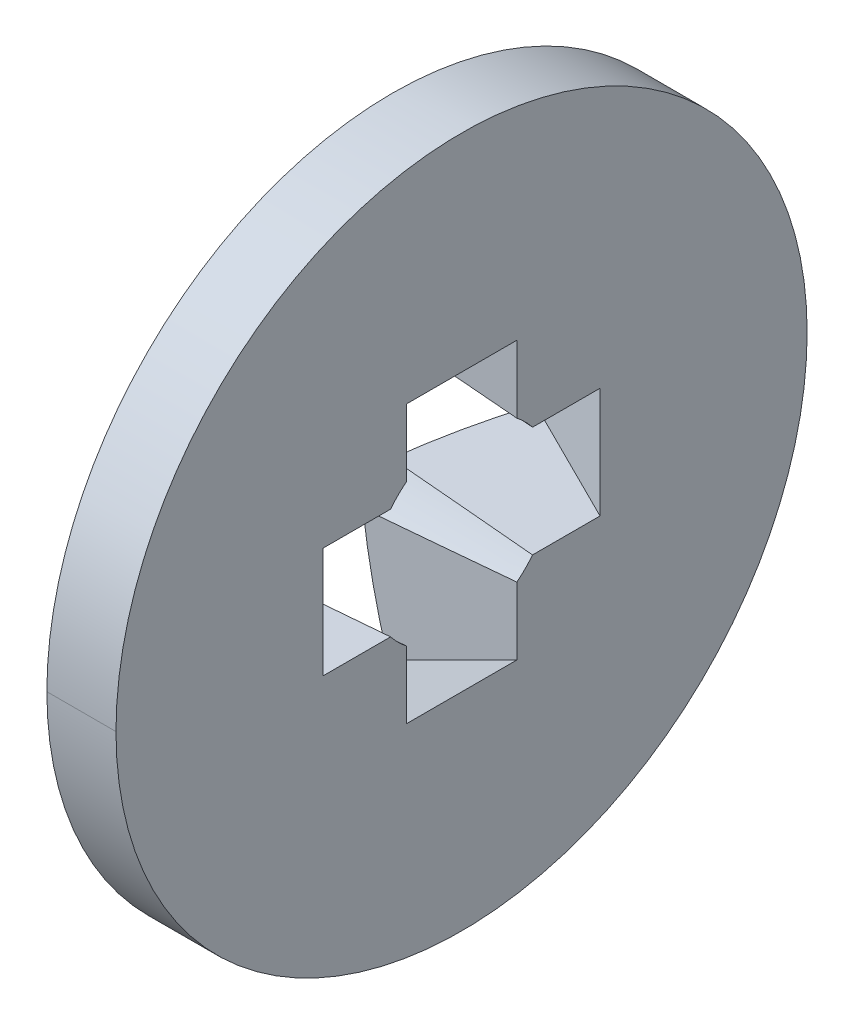
ISO-10303-21;
HEADER;
FILE_DESCRIPTION(('STEP AP214'),'2;1');
FILE_NAME('part.step','',(''),(''),'','','');
FILE_SCHEMA(('AUTOMOTIVE_DESIGN { 1 0 10303 214 1 1 1 1 }'));
ENDSEC;
DATA;
#1=APPLICATION_CONTEXT('core data for automotive mechanical design processes');
#2=APPLICATION_PROTOCOL_DEFINITION('international standard','automotive_design',2000,#1);
#3=PRODUCT_CONTEXT('',#1,'mechanical');
#4=PRODUCT('Part','Part','',(#3));
#5=PRODUCT_RELATED_PRODUCT_CATEGORY('part','',(#4));
#6=PRODUCT_DEFINITION_FORMATION('','',#4);
#7=PRODUCT_DEFINITION_CONTEXT('part definition',#1,'design');
#8=PRODUCT_DEFINITION('design','',#6,#7);
#9=PRODUCT_DEFINITION_SHAPE('','',#8);
#10=(LENGTH_UNIT() NAMED_UNIT(*) SI_UNIT(.MILLI.,.METRE.));
#11=(NAMED_UNIT(*) PLANE_ANGLE_UNIT() SI_UNIT($,.RADIAN.));
#12=(NAMED_UNIT(*) SI_UNIT($,.STERADIAN.) SOLID_ANGLE_UNIT());
#13=UNCERTAINTY_MEASURE_WITH_UNIT(LENGTH_MEASURE(1.E-05),#10,'distance_accuracy_value','');
#14=(GEOMETRIC_REPRESENTATION_CONTEXT(3) GLOBAL_UNCERTAINTY_ASSIGNED_CONTEXT((#13)) GLOBAL_UNIT_ASSIGNED_CONTEXT((#10,
#11,#12)) REPRESENTATION_CONTEXT('',''));
#15=CARTESIAN_POINT('',(0.,0.,0.));
#16=DIRECTION('',(0.,0.,1.));
#17=DIRECTION('',(1.,0.,0.));
#18=AXIS2_PLACEMENT_3D('',#15,#16,#17);
#19=CARTESIAN_POINT('',(0.7,0.,0.));
#20=DIRECTION('',(1.,0.,0.));
#21=DIRECTION('',(0.,0.,-1.));
#22=AXIS2_PLACEMENT_3D('',#19,#20,#21);
#23=PLANE('',#22);
#24=CARTESIAN_POINT('',(0.7,0.,0.));
#25=DIRECTION('',(-1.,0.,0.));
#26=DIRECTION('',(0.,0.,1.));
#27=AXIS2_PLACEMENT_3D('',#24,#25,#26);
#28=CIRCLE('',#27,1.5);
#29=CARTESIAN_POINT('',(0.7,0.,1.5));
#30=VERTEX_POINT('',#29);
#31=CARTESIAN_POINT('',(0.7,0.,-1.5));
#32=VERTEX_POINT('',#31);
#33=EDGE_CURVE('E48',#30,#32,#28,.T.);
#34=ORIENTED_EDGE('',*,*,#33,.F.);
#35=CARTESIAN_POINT('',(0.7,0.,0.));
#36=DIRECTION('',(-1.,0.,0.));
#37=DIRECTION('',(0.,0.,1.));
#38=AXIS2_PLACEMENT_3D('',#35,#36,#37);
#39=CIRCLE('',#38,1.5);
#40=EDGE_CURVE('E295',#32,#30,#39,.T.);
#41=ORIENTED_EDGE('',*,*,#40,.F.);
#42=EDGE_LOOP('',(#34,#41));
#43=FACE_BOUND('',#42,.T.);
#44=DIRECTION('',(0.,0.,1.));
#45=VECTOR('',#44,1.);
#46=CARTESIAN_POINT('',(0.7,0.24,0.351702170390125));
#47=LINE('',#46,#45);
#48=CARTESIAN_POINT('',(0.700000062642924,0.240005255745666,0.307988734916733));
#49=VERTEX_POINT('',#48);
#50=CARTESIAN_POINT('',(0.700000000000001,0.239999999999998,0.600992932727572));
#51=VERTEX_POINT('',#50);
#52=EDGE_CURVE('E272',#49,#51,#47,.T.);
#53=ORIENTED_EDGE('',*,*,#52,.F.);
#54=CARTESIAN_POINT('',(0.7,0.,0.));
#55=DIRECTION('',(1.,0.,0.));
#56=DIRECTION('',(0.,0.,-1.));
#57=AXIS2_PLACEMENT_3D('',#54,#55,#56);
#58=CIRCLE('',#57,0.390463405971752);
#59=CARTESIAN_POINT('',(0.700000062674974,0.307988734913892,0.240005255745666));
#60=VERTEX_POINT('',#59);
#61=EDGE_CURVE('E279',#49,#60,#58,.F.);
#62=ORIENTED_EDGE('',*,*,#61,.T.);
#63=DIRECTION('',(0.,-1.,0.));
#64=VECTOR('',#63,1.);
#65=CARTESIAN_POINT('',(0.7,-0.351702170390125,0.24));
#66=LINE('',#65,#64);
#67=CARTESIAN_POINT('',(0.700000000000001,0.600992932727572,0.24));
#68=VERTEX_POINT('',#67);
#69=EDGE_CURVE('E277',#68,#60,#66,.T.);
#70=ORIENTED_EDGE('',*,*,#69,.F.);
#71=DIRECTION('',(0.,0.,-1.));
#72=VECTOR('',#71,1.);
#73=CARTESIAN_POINT('',(0.7,0.600992932727573,0.24));
#74=LINE('',#73,#72);
#75=CARTESIAN_POINT('',(0.700000000000001,0.600992932727572,-0.24));
#76=VERTEX_POINT('',#75);
#77=EDGE_CURVE('E63',#68,#76,#74,.T.);
#78=ORIENTED_EDGE('',*,*,#77,.T.);
#79=DIRECTION('',(0.,1.,0.));
#80=VECTOR('',#79,1.);
#81=CARTESIAN_POINT('',(0.7,0.351702170390125,-0.24));
#82=LINE('',#81,#80);
#83=CARTESIAN_POINT('',(0.700000062642924,0.307988734916733,-0.240005255745666));
#84=VERTEX_POINT('',#83);
#85=EDGE_CURVE('E56',#84,#76,#82,.T.);
#86=ORIENTED_EDGE('',*,*,#85,.F.);
#87=CARTESIAN_POINT('',(0.7,0.,0.));
#88=DIRECTION('',(1.,0.,0.));
#89=DIRECTION('',(0.,0.,-1.));
#90=AXIS2_PLACEMENT_3D('',#87,#88,#89);
#91=CIRCLE('',#90,0.390463405971752);
#92=CARTESIAN_POINT('',(0.700000062674974,0.240005255745668,-0.30798873491389));
#93=VERTEX_POINT('',#92);
#94=EDGE_CURVE('E250',#84,#93,#91,.F.);
#95=ORIENTED_EDGE('',*,*,#94,.T.);
#96=DIRECTION('',(0.,0.,1.));
#97=VECTOR('',#96,1.);
#98=CARTESIAN_POINT('',(0.7,0.24,0.351702170390125));
#99=LINE('',#98,#97);
#100=CARTESIAN_POINT('',(0.700000000000001,0.240000000000002,-0.600992932727573));
#101=VERTEX_POINT('',#100);
#102=EDGE_CURVE('E242',#101,#93,#99,.T.);
#103=ORIENTED_EDGE('',*,*,#102,.F.);
#104=DIRECTION('',(0.,-1.,0.));
#105=VECTOR('',#104,1.);
#106=CARTESIAN_POINT('',(0.7,0.240000000000001,-0.600992932727571));
#107=LINE('',#106,#105);
#108=CARTESIAN_POINT('',(0.700000000000001,-0.239999999999997,-0.600992932727573));
#109=VERTEX_POINT('',#108);
#110=EDGE_CURVE('E225',#101,#109,#107,.T.);
#111=ORIENTED_EDGE('',*,*,#110,.T.);
#112=DIRECTION('',(0.,0.,-1.));
#113=VECTOR('',#112,1.);
#114=CARTESIAN_POINT('',(0.7,-0.24,-0.351702170390125));
#115=LINE('',#114,#113);
#116=CARTESIAN_POINT('',(0.700000062642925,-0.240005255745665,-0.307988734916734));
#117=VERTEX_POINT('',#116);
#118=EDGE_CURVE('E226',#117,#109,#115,.T.);
#119=ORIENTED_EDGE('',*,*,#118,.F.);
#120=CARTESIAN_POINT('',(0.7,0.,0.));
#121=DIRECTION('',(1.,0.,0.));
#122=DIRECTION('',(0.,0.,-1.));
#123=AXIS2_PLACEMENT_3D('',#120,#121,#122);
#124=CIRCLE('',#123,0.390463405971752);
#125=CARTESIAN_POINT('',(0.7,-0.307988028624602,-0.24001051149271));
#126=VERTEX_POINT('',#125);
#127=EDGE_CURVE('E12',#117,#126,#124,.F.);
#128=ORIENTED_EDGE('',*,*,#127,.T.);
#129=DIRECTION('',(0.,1.,0.));
#130=VECTOR('',#129,1.);
#131=CARTESIAN_POINT('',(0.7,0.351702170390125,-0.24));
#132=LINE('',#131,#130);
#133=CARTESIAN_POINT('',(0.700000000000001,-0.600992932727573,-0.24));
#134=VERTEX_POINT('',#133);
#135=EDGE_CURVE('E220',#134,#126,#132,.T.);
#136=ORIENTED_EDGE('',*,*,#135,.F.);
#137=DIRECTION('',(0.,0.,1.));
#138=VECTOR('',#137,1.);
#139=CARTESIAN_POINT('',(0.7,-0.600992932727572,-0.24));
#140=LINE('',#139,#138);
#141=CARTESIAN_POINT('',(0.700000000000001,-0.600992932727573,0.24));
#142=VERTEX_POINT('',#141);
#143=EDGE_CURVE('E244',#134,#142,#140,.T.);
#144=ORIENTED_EDGE('',*,*,#143,.T.);
#145=DIRECTION('',(0.,-1.,0.));
#146=VECTOR('',#145,1.);
#147=CARTESIAN_POINT('',(0.7,-0.351702170390125,0.24));
#148=LINE('',#147,#146);
#149=CARTESIAN_POINT('',(0.700000062642924,-0.307988734916733,0.240005255745666));
#150=VERTEX_POINT('',#149);
#151=EDGE_CURVE('E248',#150,#142,#148,.T.);
#152=ORIENTED_EDGE('',*,*,#151,.F.);
#153=CARTESIAN_POINT('',(0.7,0.,0.));
#154=DIRECTION('',(1.,0.,0.));
#155=DIRECTION('',(0.,0.,-1.));
#156=AXIS2_PLACEMENT_3D('',#153,#154,#155);
#157=CIRCLE('',#156,0.390463405971752);
#158=CARTESIAN_POINT('',(0.700000062674974,-0.240005255745667,0.307988734913891));
#159=VERTEX_POINT('',#158);
#160=EDGE_CURVE('E255',#150,#159,#157,.F.);
#161=ORIENTED_EDGE('',*,*,#160,.T.);
#162=DIRECTION('',(0.,0.,-1.));
#163=VECTOR('',#162,1.);
#164=CARTESIAN_POINT('',(0.7,-0.24,-0.351702170390125));
#165=LINE('',#164,#163);
#166=CARTESIAN_POINT('',(0.700000000000001,-0.240000000000002,0.600992932727572));
#167=VERTEX_POINT('',#166);
#168=EDGE_CURVE('E260',#167,#159,#165,.T.);
#169=ORIENTED_EDGE('',*,*,#168,.F.);
#170=DIRECTION('',(0.,1.,0.));
#171=VECTOR('',#170,1.);
#172=CARTESIAN_POINT('',(0.7,-0.240000000000001,0.600992932727572));
#173=LINE('',#172,#171);
#174=EDGE_CURVE('E267',#167,#51,#173,.T.);
#175=ORIENTED_EDGE('',*,*,#174,.T.);
#176=EDGE_LOOP('',(#53,#62,#70,#78,#86,#95,#103,#111,#119,#128,#136,#144,#152,#161,#169,#175));
#177=FACE_BOUND('',#176,.T.);
#178=ADVANCED_FACE('F37',(#43,#177),#23,.T.);
#179=CARTESIAN_POINT('',(1.2,0.351702170390125,-0.24));
#180=DIRECTION('',(0.,0.,1.));
#181=DIRECTION('',(1.,0.,0.));
#182=AXIS2_PLACEMENT_3D('',#179,#180,#181);
#183=PLANE('',#182);
#184=CARTESIAN_POINT('',(0.0318913292717859,0.365415109129044,-0.24));
#185=CARTESIAN_POINT('',(0.71193204756683,0.308522672736319,-0.24));
#186=CARTESIAN_POINT('',(1.2,0.262259890185287,-0.24));
#187=B_SPLINE_CURVE_WITH_KNOTS('',2,(#184,#185,#186),.UNSPECIFIED.,.F.,.F.,(3,3),(0.,1.),.UNSPECIFIED.);
#188=CARTESIAN_POINT('',(0.0318913292717861,0.365415109129044,-0.24));
#189=VERTEX_POINT('',#188);
#190=EDGE_CURVE('E215',#189,#84,#187,.T.);
#191=ORIENTED_EDGE('',*,*,#190,.T.);
#192=ORIENTED_EDGE('',*,*,#85,.T.);
#193=DIRECTION('',(0.894934391398443,-0.446197753347436,0.));
#194=VECTOR('',#193,1.);
#195=CARTESIAN_POINT('',(0.,0.95,-0.24));
#196=LINE('',#195,#194);
#197=CARTESIAN_POINT('',(0.141276153719429,0.879562319878362,-0.24));
#198=VERTEX_POINT('',#197);
#199=EDGE_CURVE('E337',#198,#76,#196,.T.);
#200=ORIENTED_EDGE('',*,*,#199,.F.);
#201=CARTESIAN_POINT('',(3.0125,0.,-0.24));
#202=DIRECTION('',(0.,0.,-1.));
#203=DIRECTION('',(1.,0.,0.));
#204=AXIS2_PLACEMENT_3D('',#201,#202,#203);
#205=CIRCLE('',#204,3.00292461610344);
#206=EDGE_CURVE('E438',#189,#198,#205,.T.);
#207=ORIENTED_EDGE('',*,*,#206,.F.);
#208=EDGE_LOOP('',(#191,#192,#200,#207));
#209=FACE_BOUND('',#208,.T.);
#210=ADVANCED_FACE('F385',(#209),#183,.T.);
#211=CARTESIAN_POINT('',(1.2,0.351702170390125,-0.24));
#212=DIRECTION('',(0.,0.,1.));
#213=DIRECTION('',(1.,0.,0.));
#214=AXIS2_PLACEMENT_3D('',#211,#212,#213);
#215=PLANE('',#214);
#216=DIRECTION('',(0.894934391398443,0.446197753347435,0.));
#217=VECTOR('',#216,1.);
#218=CARTESIAN_POINT('',(0.,-0.95,-0.24));
#219=LINE('',#218,#217);
#220=CARTESIAN_POINT('',(0.141276153719429,-0.879562319878361,-0.24));
#221=VERTEX_POINT('',#220);
#222=EDGE_CURVE('E216',#221,#134,#219,.T.);
#223=ORIENTED_EDGE('',*,*,#222,.T.);
#224=ORIENTED_EDGE('',*,*,#135,.T.);
#225=CARTESIAN_POINT('',(1.2,-0.262259890185288,-0.24));
#226=CARTESIAN_POINT('',(0.711932047566841,-0.308522672736318,-0.24));
#227=CARTESIAN_POINT('',(0.0318913292717859,-0.365415109129044,-0.24));
#228=B_SPLINE_CURVE_WITH_KNOTS('',2,(#225,#226,#227),.UNSPECIFIED.,.F.,.F.,(3,3),(0.,1.),.UNSPECIFIED.);
#229=CARTESIAN_POINT('',(0.0318913292717861,-0.365415109129044,-0.24));
#230=VERTEX_POINT('',#229);
#231=EDGE_CURVE('E203',#126,#230,#228,.T.);
#232=ORIENTED_EDGE('',*,*,#231,.T.);
#233=CARTESIAN_POINT('',(3.0125,0.,-0.24));
#234=DIRECTION('',(0.,0.,-1.));
#235=DIRECTION('',(1.,0.,0.));
#236=AXIS2_PLACEMENT_3D('',#233,#234,#235);
#237=CIRCLE('',#236,3.00292461610344);
#238=EDGE_CURVE('E336',#221,#230,#237,.T.);
#239=ORIENTED_EDGE('',*,*,#238,.F.);
#240=EDGE_LOOP('',(#223,#224,#232,#239));
#241=FACE_BOUND('',#240,.T.);
#242=ADVANCED_FACE('F221',(#241),#215,.T.);
#243=CARTESIAN_POINT('',(1.2,-0.351702170390125,0.24));
#244=DIRECTION('',(0.,0.,-1.));
#245=DIRECTION('',(0.,-1.,0.));
#246=AXIS2_PLACEMENT_3D('',#243,#244,#245);
#247=PLANE('',#246);
#248=DIRECTION('',(0.894934391398443,-0.446197753347436,0.));
#249=VECTOR('',#248,1.);
#250=CARTESIAN_POINT('',(0.,0.95,0.24));
#251=LINE('',#250,#249);
#252=CARTESIAN_POINT('',(0.141276153719429,0.879562319878362,0.24));
#253=VERTEX_POINT('',#252);
#254=EDGE_CURVE('E372',#253,#68,#251,.T.);
#255=ORIENTED_EDGE('',*,*,#254,.T.);
#256=ORIENTED_EDGE('',*,*,#69,.T.);
#257=CARTESIAN_POINT('',(1.2,0.262259890185288,0.24));
#258=CARTESIAN_POINT('',(0.711932047566804,0.308522672736322,0.24));
#259=CARTESIAN_POINT('',(0.0318913292717859,0.365415109129044,0.24));
#260=B_SPLINE_CURVE_WITH_KNOTS('',2,(#257,#258,#259),.UNSPECIFIED.,.F.,.F.,(3,3),(0.,1.),.UNSPECIFIED.);
#261=CARTESIAN_POINT('',(0.0318913292717861,0.365415109129044,0.24));
#262=VERTEX_POINT('',#261);
#263=EDGE_CURVE('E362',#60,#262,#260,.T.);
#264=ORIENTED_EDGE('',*,*,#263,.T.);
#265=CARTESIAN_POINT('',(3.0125,0.,0.24));
#266=DIRECTION('',(0.,0.,1.));
#267=DIRECTION('',(-1.,0.,0.));
#268=AXIS2_PLACEMENT_3D('',#265,#266,#267);
#269=CIRCLE('',#268,3.00292461610344);
#270=EDGE_CURVE('E332',#253,#262,#269,.T.);
#271=ORIENTED_EDGE('',*,*,#270,.F.);
#272=EDGE_LOOP('',(#255,#256,#264,#271));
#273=FACE_BOUND('',#272,.T.);
#274=ADVANCED_FACE('F498',(#273),#247,.T.);
#275=CARTESIAN_POINT('',(1.2,-0.351702170390125,0.24));
#276=DIRECTION('',(0.,0.,-1.));
#277=DIRECTION('',(0.,-1.,0.));
#278=AXIS2_PLACEMENT_3D('',#275,#276,#277);
#279=PLANE('',#278);
#280=CARTESIAN_POINT('',(0.0318913292717859,-0.365415109129044,0.24));
#281=CARTESIAN_POINT('',(0.711932047566801,-0.308522672736322,0.24));
#282=CARTESIAN_POINT('',(1.2,-0.262259890185288,0.24));
#283=B_SPLINE_CURVE_WITH_KNOTS('',2,(#280,#281,#282),.UNSPECIFIED.,.F.,.F.,(3,3),(0.,1.),.UNSPECIFIED.);
#284=CARTESIAN_POINT('',(0.0318913292717861,-0.365415109129044,0.24));
#285=VERTEX_POINT('',#284);
#286=EDGE_CURVE('E327',#285,#150,#283,.T.);
#287=ORIENTED_EDGE('',*,*,#286,.T.);
#288=ORIENTED_EDGE('',*,*,#151,.T.);
#289=DIRECTION('',(0.894934391398443,0.446197753347435,0.));
#290=VECTOR('',#289,1.);
#291=CARTESIAN_POINT('',(0.,-0.95,0.24));
#292=LINE('',#291,#290);
#293=CARTESIAN_POINT('',(0.141276153719429,-0.879562319878361,0.24));
#294=VERTEX_POINT('',#293);
#295=EDGE_CURVE('E319',#294,#142,#292,.T.);
#296=ORIENTED_EDGE('',*,*,#295,.F.);
#297=CARTESIAN_POINT('',(3.0125,0.,0.24));
#298=DIRECTION('',(0.,0.,1.));
#299=DIRECTION('',(-1.,0.,0.));
#300=AXIS2_PLACEMENT_3D('',#297,#298,#299);
#301=CIRCLE('',#300,3.00292461610344);
#302=EDGE_CURVE('E299',#285,#294,#301,.T.);
#303=ORIENTED_EDGE('',*,*,#302,.F.);
#304=EDGE_LOOP('',(#287,#288,#296,#303));
#305=FACE_BOUND('',#304,.T.);
#306=ADVANCED_FACE('F508',(#305),#279,.T.);
#307=CARTESIAN_POINT('',(1.2,0.351702170390125,0.24));
#308=DIRECTION('',(0.446197753347436,0.894934391398443,0.));
#309=DIRECTION('',(0.,0.,-1.));
#310=AXIS2_PLACEMENT_3D('',#307,#308,#309);
#311=PLANE('',#310);
#312=ORIENTED_EDGE('',*,*,#77,.F.);
#313=ORIENTED_EDGE('',*,*,#254,.F.);
#314=CARTESIAN_POINT('',(2.79208586837802,-0.442082429279145,0.));
#315=DIRECTION('',(-0.446197753347436,-0.894934391398443,0.));
#316=DIRECTION('',(-0.894934391398443,0.446197753347436,0.));
#317=AXIS2_PLACEMENT_3D('',#314,#315,#316);
#318=CIRCLE('',#317,2.97172289864044);
#319=CARTESIAN_POINT('',(0.132588844678418,0.883893651665352,0.));
#320=VERTEX_POINT('',#319);
#321=EDGE_CURVE('E324',#253,#320,#318,.T.);
#322=ORIENTED_EDGE('',*,*,#321,.T.);
#323=CARTESIAN_POINT('',(2.79208586837802,-0.442082429279145,0.));
#324=DIRECTION('',(-0.446197753347436,-0.894934391398443,0.));
#325=DIRECTION('',(-0.894934391398443,0.446197753347436,0.));
#326=AXIS2_PLACEMENT_3D('',#323,#324,#325);
#327=CIRCLE('',#326,2.97172289864044);
#328=EDGE_CURVE('E328',#320,#198,#327,.T.);
#329=ORIENTED_EDGE('',*,*,#328,.T.);
#330=ORIENTED_EDGE('',*,*,#199,.T.);
#331=EDGE_LOOP('',(#312,#313,#322,#329,#330));
#332=FACE_BOUND('',#331,.T.);
#333=ADVANCED_FACE('F519',(#332),#311,.F.);
#334=CARTESIAN_POINT('',(1.2,-0.351702170390125,-0.24));
#335=DIRECTION('',(0.446197753347435,-0.894934391398443,0.));
#336=DIRECTION('',(0.,0.,-1.));
#337=AXIS2_PLACEMENT_3D('',#334,#335,#336);
#338=PLANE('',#337);
#339=ORIENTED_EDGE('',*,*,#143,.F.);
#340=ORIENTED_EDGE('',*,*,#222,.F.);
#341=CARTESIAN_POINT('',(2.79208586837802,0.442082429279144,0.));
#342=DIRECTION('',(-0.446197753347435,0.894934391398443,0.));
#343=DIRECTION('',(0.894934391398443,0.446197753347435,0.));
#344=AXIS2_PLACEMENT_3D('',#341,#342,#343);
#345=CIRCLE('',#344,2.97172289864044);
#346=CARTESIAN_POINT('',(0.132588844678418,-0.88389365166535,0.));
#347=VERTEX_POINT('',#346);
#348=EDGE_CURVE('E340',#221,#347,#345,.T.);
#349=ORIENTED_EDGE('',*,*,#348,.T.);
#350=CARTESIAN_POINT('',(2.79208586837802,0.442082429279144,0.));
#351=DIRECTION('',(-0.446197753347435,0.894934391398443,0.));
#352=DIRECTION('',(0.894934391398443,0.446197753347435,0.));
#353=AXIS2_PLACEMENT_3D('',#350,#351,#352);
#354=CIRCLE('',#353,2.97172289864044);
#355=EDGE_CURVE('E323',#347,#294,#354,.T.);
#356=ORIENTED_EDGE('',*,*,#355,.T.);
#357=ORIENTED_EDGE('',*,*,#295,.T.);
#358=EDGE_LOOP('',(#339,#340,#349,#356,#357));
#359=FACE_BOUND('',#358,.T.);
#360=ADVANCED_FACE('F395',(#359),#338,.F.);
#361=CARTESIAN_POINT('',(1.2,-0.24,-0.351702170390125));
#362=DIRECTION('',(0.,1.,0.));
#363=DIRECTION('',(1.,0.,0.));
#364=AXIS2_PLACEMENT_3D('',#361,#362,#363);
#365=PLANE('',#364);
#366=DIRECTION('',(0.894934391398443,0.,-0.446197753347436));
#367=VECTOR('',#366,1.);
#368=CARTESIAN_POINT('',(0.,-0.240000000000003,0.95));
#369=LINE('',#368,#367);
#370=CARTESIAN_POINT('',(0.141276153719429,-0.240000000000002,0.879562319878361));
#371=VERTEX_POINT('',#370);
#372=EDGE_CURVE('E301',#371,#167,#369,.T.);
#373=ORIENTED_EDGE('',*,*,#372,.T.);
#374=ORIENTED_EDGE('',*,*,#168,.T.);
#375=CARTESIAN_POINT('',(1.2,-0.240000000000002,0.262259890185287));
#376=CARTESIAN_POINT('',(0.711932047566749,-0.240000000000002,0.308522672736326));
#377=CARTESIAN_POINT('',(0.0318913292717861,-0.240000000000002,0.365415109129042));
#378=B_SPLINE_CURVE_WITH_KNOTS('',2,(#375,#376,#377),.UNSPECIFIED.,.F.,.F.,(3,3),(0.,1.),.UNSPECIFIED.);
#379=CARTESIAN_POINT('',(0.031891329271786,-0.24,0.365415109129042));
#380=VERTEX_POINT('',#379);
#381=EDGE_CURVE('E305',#159,#380,#378,.T.);
#382=ORIENTED_EDGE('',*,*,#381,.T.);
#383=CARTESIAN_POINT('',(3.0125,-0.24,0.));
#384=DIRECTION('',(0.,-1.,0.));
#385=DIRECTION('',(0.,0.,1.));
#386=AXIS2_PLACEMENT_3D('',#383,#384,#385);
#387=CIRCLE('',#386,3.00292461610344);
#388=EDGE_CURVE('E556',#371,#380,#387,.T.);
#389=ORIENTED_EDGE('',*,*,#388,.F.);
#390=EDGE_LOOP('',(#373,#374,#382,#389));
#391=FACE_BOUND('',#390,.T.);
#392=ADVANCED_FACE('F509',(#391),#365,.T.);
#393=CARTESIAN_POINT('',(1.2,0.24,0.351702170390125));
#394=DIRECTION('',(0.,-1.,0.));
#395=DIRECTION('',(0.,0.,-1.));
#396=AXIS2_PLACEMENT_3D('',#393,#394,#395);
#397=PLANE('',#396);
#398=CARTESIAN_POINT('',(0.0318913292717859,0.24,0.365415109129044));
#399=CARTESIAN_POINT('',(0.711932047566747,0.24,0.308522672736327));
#400=CARTESIAN_POINT('',(1.2,0.24,0.262259890185289));
#401=B_SPLINE_CURVE_WITH_KNOTS('',2,(#398,#399,#400),.UNSPECIFIED.,.F.,.F.,(3,3),(0.,1.),.UNSPECIFIED.);
#402=CARTESIAN_POINT('',(0.0318913292717862,0.24,0.365415109129044));
#403=VERTEX_POINT('',#402);
#404=EDGE_CURVE('E306',#403,#49,#401,.T.);
#405=ORIENTED_EDGE('',*,*,#404,.T.);
#406=ORIENTED_EDGE('',*,*,#52,.T.);
#407=DIRECTION('',(0.894934391398443,0.,-0.446197753347436));
#408=VECTOR('',#407,1.);
#409=CARTESIAN_POINT('',(0.,0.239999999999997,0.95));
#410=LINE('',#409,#408);
#411=CARTESIAN_POINT('',(0.141276153719429,0.239999999999997,0.879562319878363));
#412=VERTEX_POINT('',#411);
#413=EDGE_CURVE('E344',#412,#51,#410,.T.);
#414=ORIENTED_EDGE('',*,*,#413,.F.);
#415=CARTESIAN_POINT('',(3.0125,0.24,0.));
#416=DIRECTION('',(0.,1.,0.));
#417=DIRECTION('',(0.,0.,-1.));
#418=AXIS2_PLACEMENT_3D('',#415,#416,#417);
#419=CIRCLE('',#418,3.00292461610344);
#420=EDGE_CURVE('E578',#403,#412,#419,.T.);
#421=ORIENTED_EDGE('',*,*,#420,.F.);
#422=EDGE_LOOP('',(#405,#406,#414,#421));
#423=FACE_BOUND('',#422,.T.);
#424=ADVANCED_FACE('F594',(#423),#397,.T.);
#425=CARTESIAN_POINT('',(1.2,-0.24,0.351702170390124));
#426=DIRECTION('',(0.446197753347436,0.,0.894934391398443));
#427=DIRECTION('',(0.,-1.,0.));
#428=AXIS2_PLACEMENT_3D('',#425,#426,#427);
#429=PLANE('',#428);
#430=ORIENTED_EDGE('',*,*,#174,.F.);
#431=ORIENTED_EDGE('',*,*,#372,.F.);
#432=CARTESIAN_POINT('',(2.79208586837802,0.,-0.442082429279145));
#433=DIRECTION('',(-0.446197753347436,0.,-0.894934391398443));
#434=DIRECTION('',(0.894934391398443,0.,-0.446197753347436));
#435=AXIS2_PLACEMENT_3D('',#432,#433,#434);
#436=CIRCLE('',#435,2.97172289864044);
#437=EDGE_CURVE('E348',#371,#412,#436,.T.);
#438=ORIENTED_EDGE('',*,*,#437,.T.);
#439=ORIENTED_EDGE('',*,*,#413,.T.);
#440=EDGE_LOOP('',(#430,#431,#438,#439));
#441=FACE_BOUND('',#440,.T.);
#442=ADVANCED_FACE('F603',(#441),#429,.F.);
#443=CARTESIAN_POINT('',(1.2,0.24,0.351702170390125));
#444=DIRECTION('',(0.,-1.,0.));
#445=DIRECTION('',(0.,0.,-1.));
#446=AXIS2_PLACEMENT_3D('',#443,#444,#445);
#447=PLANE('',#446);
#448=DIRECTION('',(0.894934391398443,0.,0.446197753347435));
#449=VECTOR('',#448,1.);
#450=CARTESIAN_POINT('',(0.,0.240000000000004,-0.95));
#451=LINE('',#450,#449);
#452=CARTESIAN_POINT('',(0.141276153719429,0.240000000000003,-0.87956231987836));
#453=VERTEX_POINT('',#452);
#454=EDGE_CURVE('E366',#453,#101,#451,.T.);
#455=ORIENTED_EDGE('',*,*,#454,.T.);
#456=ORIENTED_EDGE('',*,*,#102,.T.);
#457=CARTESIAN_POINT('',(1.2,0.240000000000002,-0.262259890185287));
#458=CARTESIAN_POINT('',(0.711932047566749,0.240000000000002,-0.308522672736326));
#459=CARTESIAN_POINT('',(0.0318913292717859,0.240000000000002,-0.365415109129042));
#460=B_SPLINE_CURVE_WITH_KNOTS('',2,(#457,#458,#459),.UNSPECIFIED.,.F.,.F.,(3,3),(0.,1.),.UNSPECIFIED.);
#461=CARTESIAN_POINT('',(0.031891329271786,0.24,-0.365415109129042));
#462=VERTEX_POINT('',#461);
#463=EDGE_CURVE('E349',#93,#462,#460,.T.);
#464=ORIENTED_EDGE('',*,*,#463,.T.);
#465=CARTESIAN_POINT('',(3.0125,0.24,0.));
#466=DIRECTION('',(0.,1.,0.));
#467=DIRECTION('',(0.,0.,-1.));
#468=AXIS2_PLACEMENT_3D('',#465,#466,#467);
#469=CIRCLE('',#468,3.00292461610344);
#470=EDGE_CURVE('E422',#453,#462,#469,.T.);
#471=ORIENTED_EDGE('',*,*,#470,.F.);
#472=EDGE_LOOP('',(#455,#456,#464,#471));
#473=FACE_BOUND('',#472,.T.);
#474=ADVANCED_FACE('F39',(#473),#447,.T.);
#475=CARTESIAN_POINT('',(1.2,-0.24,-0.351702170390125));
#476=DIRECTION('',(0.,1.,0.));
#477=DIRECTION('',(1.,0.,0.));
#478=AXIS2_PLACEMENT_3D('',#475,#476,#477);
#479=PLANE('',#478);
#480=CARTESIAN_POINT('',(0.0318913292717859,-0.24,-0.365415109129044));
#481=CARTESIAN_POINT('',(0.71193204756674,-0.24,-0.308522672736328));
#482=CARTESIAN_POINT('',(1.2,-0.24,-0.262259890185289));
#483=B_SPLINE_CURVE_WITH_KNOTS('',2,(#480,#481,#482),.UNSPECIFIED.,.F.,.F.,(3,3),(0.,1.),.UNSPECIFIED.);
#484=CARTESIAN_POINT('',(0.0318913292717862,-0.24,-0.365415109129044));
#485=VERTEX_POINT('',#484);
#486=EDGE_CURVE('E365',#485,#117,#483,.T.);
#487=ORIENTED_EDGE('',*,*,#486,.T.);
#488=ORIENTED_EDGE('',*,*,#118,.T.);
#489=DIRECTION('',(0.894934391398443,0.,0.446197753347435));
#490=VECTOR('',#489,1.);
#491=CARTESIAN_POINT('',(0.,-0.239999999999996,-0.95));
#492=LINE('',#491,#490);
#493=CARTESIAN_POINT('',(0.141276153719429,-0.239999999999997,-0.879562319878362));
#494=VERTEX_POINT('',#493);
#495=EDGE_CURVE('E291',#494,#109,#492,.T.);
#496=ORIENTED_EDGE('',*,*,#495,.F.);
#497=CARTESIAN_POINT('',(3.0125,-0.24,0.));
#498=DIRECTION('',(0.,-1.,0.));
#499=DIRECTION('',(0.,0.,1.));
#500=AXIS2_PLACEMENT_3D('',#497,#498,#499);
#501=CIRCLE('',#500,3.00292461610344);
#502=EDGE_CURVE('E413',#485,#494,#501,.T.);
#503=ORIENTED_EDGE('',*,*,#502,.F.);
#504=EDGE_LOOP('',(#487,#488,#496,#503));
#505=FACE_BOUND('',#504,.T.);
#506=ADVANCED_FACE('F515',(#505),#479,.T.);
#507=CARTESIAN_POINT('',(1.2,0.24,-0.351702170390123));
#508=DIRECTION('',(0.446197753347435,0.,-0.894934391398443));
#509=DIRECTION('',(0.,-1.,0.));
#510=AXIS2_PLACEMENT_3D('',#507,#508,#509);
#511=PLANE('',#510);
#512=ORIENTED_EDGE('',*,*,#110,.F.);
#513=ORIENTED_EDGE('',*,*,#454,.F.);
#514=CARTESIAN_POINT('',(2.79208586837802,0.,0.442082429279144));
#515=DIRECTION('',(-0.446197753347435,0.,0.894934391398443));
#516=DIRECTION('',(-0.894934391398443,0.,-0.446197753347435));
#517=AXIS2_PLACEMENT_3D('',#514,#515,#516);
#518=CIRCLE('',#517,2.97172289864044);
#519=EDGE_CURVE('E294',#453,#494,#518,.T.);
#520=ORIENTED_EDGE('',*,*,#519,.T.);
#521=ORIENTED_EDGE('',*,*,#495,.T.);
#522=EDGE_LOOP('',(#512,#513,#520,#521));
#523=FACE_BOUND('',#522,.T.);
#524=ADVANCED_FACE('F512',(#523),#511,.F.);
#525=CARTESIAN_POINT('',(1.2,0.,0.));
#526=DIRECTION('',(-1.,0.,0.));
#527=DIRECTION('',(0.,0.,1.));
#528=AXIS2_PLACEMENT_3D('',#525,#526,#527);
#529=CONICAL_SURFACE('',#528,0.3555,0.0698131700797659);
#530=ORIENTED_EDGE('',*,*,#160,.F.);
#531=ORIENTED_EDGE('',*,*,#286,.F.);
#532=CARTESIAN_POINT('',(0.0318913292717861,0.,0.));
#533=DIRECTION('',(1.,0.,0.));
#534=DIRECTION('',(0.,0.,-1.));
#535=AXIS2_PLACEMENT_3D('',#532,#533,#534);
#536=CIRCLE('',#535,0.437182115347586);
#537=EDGE_CURVE('E550',#380,#285,#536,.T.);
#538=ORIENTED_EDGE('',*,*,#537,.F.);
#539=ORIENTED_EDGE('',*,*,#381,.F.);
#540=EDGE_LOOP('',(#530,#531,#538,#539));
#541=FACE_BOUND('',#540,.T.);
#542=ADVANCED_FACE('F457',(#541),#529,.F.);
#543=CARTESIAN_POINT('',(1.2,0.,0.));
#544=DIRECTION('',(-1.,0.,0.));
#545=DIRECTION('',(0.,0.,1.));
#546=AXIS2_PLACEMENT_3D('',#543,#544,#545);
#547=CONICAL_SURFACE('',#546,0.3555,0.0698131700797659);
#548=ORIENTED_EDGE('',*,*,#61,.F.);
#549=ORIENTED_EDGE('',*,*,#404,.F.);
#550=CARTESIAN_POINT('',(0.0318913292717861,0.,0.));
#551=DIRECTION('',(1.,0.,0.));
#552=DIRECTION('',(0.,0.,-1.));
#553=AXIS2_PLACEMENT_3D('',#550,#551,#552);
#554=CIRCLE('',#553,0.437182115347586);
#555=EDGE_CURVE('E581',#262,#403,#554,.T.);
#556=ORIENTED_EDGE('',*,*,#555,.F.);
#557=ORIENTED_EDGE('',*,*,#263,.F.);
#558=EDGE_LOOP('',(#548,#549,#556,#557));
#559=FACE_BOUND('',#558,.T.);
#560=ADVANCED_FACE('F455',(#559),#547,.F.);
#561=CARTESIAN_POINT('',(1.2,0.,0.));
#562=DIRECTION('',(-1.,0.,0.));
#563=DIRECTION('',(0.,0.,1.));
#564=AXIS2_PLACEMENT_3D('',#561,#562,#563);
#565=CONICAL_SURFACE('',#564,0.3555,0.0698131700797659);
#566=ORIENTED_EDGE('',*,*,#94,.F.);
#567=ORIENTED_EDGE('',*,*,#190,.F.);
#568=CARTESIAN_POINT('',(0.0318913292717861,0.,0.));
#569=DIRECTION('',(1.,0.,0.));
#570=DIRECTION('',(0.,0.,-1.));
#571=AXIS2_PLACEMENT_3D('',#568,#569,#570);
#572=CIRCLE('',#571,0.437182115347586);
#573=EDGE_CURVE('E434',#462,#189,#572,.T.);
#574=ORIENTED_EDGE('',*,*,#573,.F.);
#575=ORIENTED_EDGE('',*,*,#463,.F.);
#576=EDGE_LOOP('',(#566,#567,#574,#575));
#577=FACE_BOUND('',#576,.T.);
#578=ADVANCED_FACE('F400',(#577),#565,.F.);
#579=CARTESIAN_POINT('',(1.2,0.,0.));
#580=DIRECTION('',(-1.,0.,0.));
#581=DIRECTION('',(0.,0.,1.));
#582=AXIS2_PLACEMENT_3D('',#579,#580,#581);
#583=CONICAL_SURFACE('',#582,0.3555,0.0698131700797659);
#584=ORIENTED_EDGE('',*,*,#127,.F.);
#585=ORIENTED_EDGE('',*,*,#486,.F.);
#586=CARTESIAN_POINT('',(0.0318913292717861,0.,0.));
#587=DIRECTION('',(1.,0.,0.));
#588=DIRECTION('',(0.,0.,-1.));
#589=AXIS2_PLACEMENT_3D('',#586,#587,#588);
#590=CIRCLE('',#589,0.437182115347586);
#591=EDGE_CURVE('E210',#230,#485,#590,.T.);
#592=ORIENTED_EDGE('',*,*,#591,.F.);
#593=ORIENTED_EDGE('',*,*,#231,.F.);
#594=EDGE_LOOP('',(#584,#585,#592,#593));
#595=FACE_BOUND('',#594,.T.);
#596=ADVANCED_FACE('F206',(#595),#583,.F.);
#597=CARTESIAN_POINT('',(-15.875,0.,0.));
#598=DIRECTION('',(-1.,0.,0.));
#599=DIRECTION('',(0.,0.,1.));
#600=AXIS2_PLACEMENT_3D('',#597,#598,#599);
#601=CYLINDRICAL_SURFACE('',#600,1.5);
#602=ORIENTED_EDGE('',*,*,#33,.T.);
#603=DIRECTION('',(-1.,0.,0.));
#604=VECTOR('',#603,1.);
#605=CARTESIAN_POINT('',(-15.875,0.,-1.5));
#606=LINE('',#605,#604);
#607=CARTESIAN_POINT('',(0.4,0.,-1.5));
#608=VERTEX_POINT('',#607);
#609=EDGE_CURVE('E290',#32,#608,#606,.T.);
#610=ORIENTED_EDGE('',*,*,#609,.T.);
#611=CARTESIAN_POINT('',(0.4,0.,0.));
#612=DIRECTION('',(-1.,0.,0.));
#613=DIRECTION('',(0.,0.,1.));
#614=AXIS2_PLACEMENT_3D('',#611,#612,#613);
#615=CIRCLE('',#614,1.5);
#616=CARTESIAN_POINT('',(0.4,1.5,0.));
#617=VERTEX_POINT('',#616);
#618=EDGE_CURVE('E296',#617,#608,#615,.T.);
#619=ORIENTED_EDGE('',*,*,#618,.F.);
#620=CARTESIAN_POINT('',(0.4,0.,0.));
#621=DIRECTION('',(-1.,0.,0.));
#622=DIRECTION('',(0.,0.,1.));
#623=AXIS2_PLACEMENT_3D('',#620,#621,#622);
#624=CIRCLE('',#623,1.5);
#625=CARTESIAN_POINT('',(0.4,0.,1.5));
#626=VERTEX_POINT('',#625);
#627=EDGE_CURVE('E307',#626,#617,#624,.T.);
#628=ORIENTED_EDGE('',*,*,#627,.F.);
#629=DIRECTION('',(-1.,0.,0.));
#630=VECTOR('',#629,1.);
#631=CARTESIAN_POINT('',(-15.875,0.,1.5));
#632=LINE('',#631,#630);
#633=EDGE_CURVE('E284',#30,#626,#632,.T.);
#634=ORIENTED_EDGE('',*,*,#633,.F.);
#635=EDGE_LOOP('',(#602,#610,#619,#628,#634));
#636=FACE_BOUND('',#635,.T.);
#637=ADVANCED_FACE('F399',(#636),#601,.T.);
#638=CARTESIAN_POINT('',(3.0125,0.,0.));
#639=DIRECTION('',(0.,0.,1.));
#640=DIRECTION('',(0.,-1.,0.));
#641=AXIS2_PLACEMENT_3D('',#638,#639,#640);
#642=SPHERICAL_SURFACE('',#641,3.0125);
#643=CARTESIAN_POINT('',(0.4,0.,0.));
#644=DIRECTION('',(-1.,0.,0.));
#645=DIRECTION('',(0.,0.,1.));
#646=AXIS2_PLACEMENT_3D('',#643,#644,#645);
#647=CIRCLE('',#646,1.5);
#648=CARTESIAN_POINT('',(0.4,-1.5,0.));
#649=VERTEX_POINT('',#648);
#650=EDGE_CURVE('E311',#649,#626,#647,.T.);
#651=ORIENTED_EDGE('',*,*,#650,.T.);
#652=ORIENTED_EDGE('',*,*,#627,.T.);
#653=CARTESIAN_POINT('',(3.0125,0.,0.));
#654=DIRECTION('',(0.,0.,1.));
#655=DIRECTION('',(0.,-1.,0.));
#656=AXIS2_PLACEMENT_3D('',#653,#654,#655);
#657=CIRCLE('',#656,3.0125);
#658=EDGE_CURVE('E312',#617,#320,#657,.T.);
#659=ORIENTED_EDGE('',*,*,#658,.T.);
#660=ORIENTED_EDGE('',*,*,#321,.F.);
#661=ORIENTED_EDGE('',*,*,#270,.T.);
#662=ORIENTED_EDGE('',*,*,#555,.T.);
#663=ORIENTED_EDGE('',*,*,#420,.T.);
#664=ORIENTED_EDGE('',*,*,#437,.F.);
#665=ORIENTED_EDGE('',*,*,#388,.T.);
#666=ORIENTED_EDGE('',*,*,#537,.T.);
#667=ORIENTED_EDGE('',*,*,#302,.T.);
#668=ORIENTED_EDGE('',*,*,#355,.F.);
#669=CARTESIAN_POINT('',(3.0125,0.,0.));
#670=DIRECTION('',(0.,0.,-1.));
#671=DIRECTION('',(-1.,0.,0.));
#672=AXIS2_PLACEMENT_3D('',#669,#670,#671);
#673=CIRCLE('',#672,3.0125);
#674=EDGE_CURVE('E316',#649,#347,#673,.T.);
#675=ORIENTED_EDGE('',*,*,#674,.F.);
#676=EDGE_LOOP('',(#651,#652,#659,#660,#661,#662,#663,#664,#665,#666,#667,#668,#675));
#677=FACE_BOUND('',#676,.T.);
#678=ADVANCED_FACE('F575',(#677),#642,.T.);
#679=CARTESIAN_POINT('',(3.0125,0.,0.));
#680=DIRECTION('',(0.,0.,1.));
#681=DIRECTION('',(0.,-1.,0.));
#682=AXIS2_PLACEMENT_3D('',#679,#680,#681);
#683=SPHERICAL_SURFACE('',#682,3.0125);
#684=ORIENTED_EDGE('',*,*,#658,.F.);
#685=ORIENTED_EDGE('',*,*,#618,.T.);
#686=CARTESIAN_POINT('',(0.4,0.,0.));
#687=DIRECTION('',(-1.,0.,0.));
#688=DIRECTION('',(0.,0.,1.));
#689=AXIS2_PLACEMENT_3D('',#686,#687,#688);
#690=CIRCLE('',#689,1.5);
#691=EDGE_CURVE('E300',#608,#649,#690,.T.);
#692=ORIENTED_EDGE('',*,*,#691,.T.);
#693=ORIENTED_EDGE('',*,*,#674,.T.);
#694=ORIENTED_EDGE('',*,*,#348,.F.);
#695=ORIENTED_EDGE('',*,*,#238,.T.);
#696=ORIENTED_EDGE('',*,*,#591,.T.);
#697=ORIENTED_EDGE('',*,*,#502,.T.);
#698=ORIENTED_EDGE('',*,*,#519,.F.);
#699=ORIENTED_EDGE('',*,*,#470,.T.);
#700=ORIENTED_EDGE('',*,*,#573,.T.);
#701=ORIENTED_EDGE('',*,*,#206,.T.);
#702=ORIENTED_EDGE('',*,*,#328,.F.);
#703=EDGE_LOOP('',(#684,#685,#692,#693,#694,#695,#696,#697,#698,#699,#700,#701,#702));
#704=FACE_BOUND('',#703,.T.);
#705=ADVANCED_FACE('F607',(#704),#683,.T.);
#706=CARTESIAN_POINT('',(-15.875,0.,0.));
#707=DIRECTION('',(-1.,0.,0.));
#708=DIRECTION('',(0.,0.,1.));
#709=AXIS2_PLACEMENT_3D('',#706,#707,#708);
#710=CYLINDRICAL_SURFACE('',#709,1.5);
#711=ORIENTED_EDGE('',*,*,#609,.F.);
#712=ORIENTED_EDGE('',*,*,#40,.T.);
#713=ORIENTED_EDGE('',*,*,#633,.T.);
#714=ORIENTED_EDGE('',*,*,#650,.F.);
#715=ORIENTED_EDGE('',*,*,#691,.F.);
#716=EDGE_LOOP('',(#711,#712,#713,#714,#715));
#717=FACE_BOUND('',#716,.T.);
#718=ADVANCED_FACE('F650',(#717),#710,.T.);
#719=CLOSED_SHELL('',(#178,#210,#242,#274,#306,#333,#360,#392,#424,#442,#474,#506,#524,#542,
#560,#578,#596,#637,#678,#705,#718));
#720=MANIFOLD_SOLID_BREP('B2',#719);
#721=ADVANCED_BREP_SHAPE_REPRESENTATION('',(#18,#720),#14);
#722=SHAPE_DEFINITION_REPRESENTATION(#9,#721);
ENDSEC;
END-ISO-10303-21;
